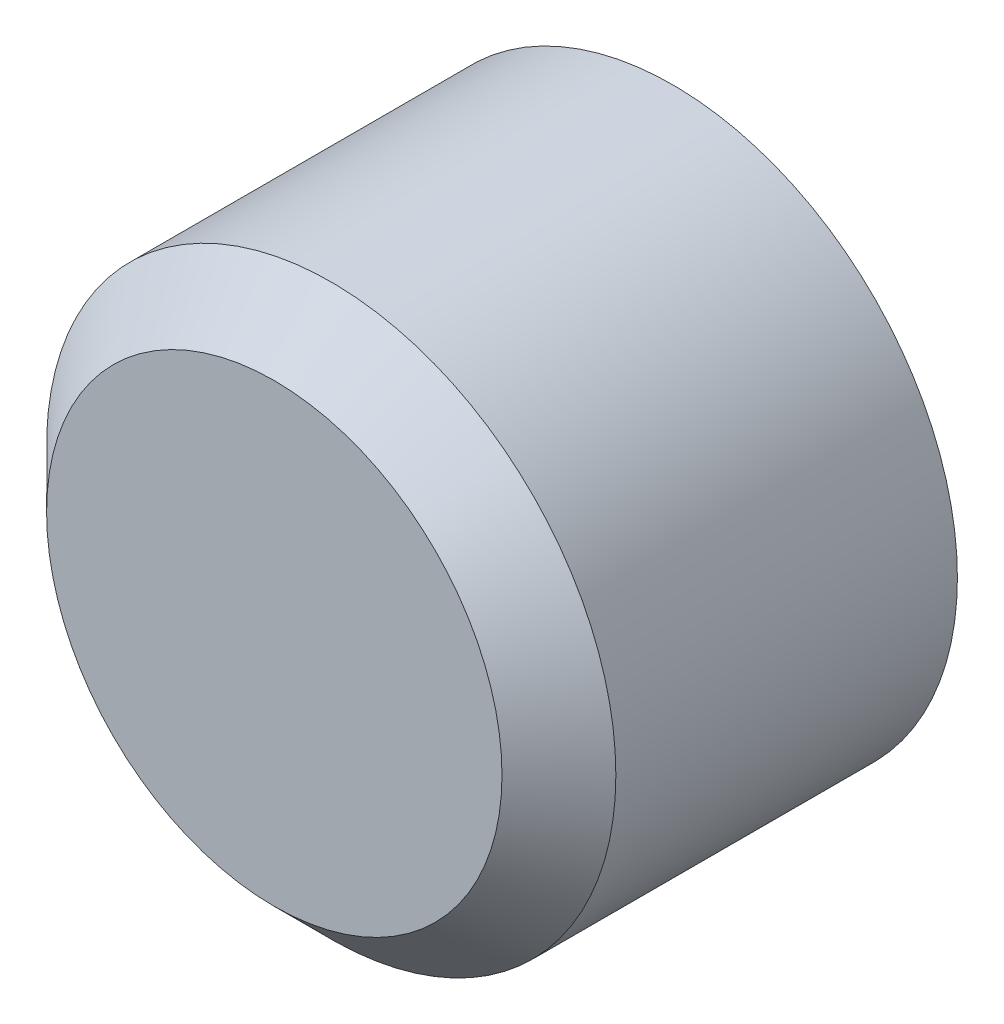
ISO-10303-21;
HEADER;
FILE_DESCRIPTION(('STEP AP214'),'2;1');
FILE_NAME('part.step','',(''),(''),'','','');
FILE_SCHEMA(('AUTOMOTIVE_DESIGN { 1 0 10303 214 1 1 1 1 }'));
ENDSEC;
DATA;
#1=APPLICATION_CONTEXT('core data for automotive mechanical design processes');
#2=APPLICATION_PROTOCOL_DEFINITION('international standard','automotive_design',2000,#1);
#3=PRODUCT_CONTEXT('',#1,'mechanical');
#4=PRODUCT('Part','Part','',(#3));
#5=PRODUCT_RELATED_PRODUCT_CATEGORY('part','',(#4));
#6=PRODUCT_DEFINITION_FORMATION('','',#4);
#7=PRODUCT_DEFINITION_CONTEXT('part definition',#1,'design');
#8=PRODUCT_DEFINITION('design','',#6,#7);
#9=PRODUCT_DEFINITION_SHAPE('','',#8);
#10=(LENGTH_UNIT() NAMED_UNIT(*) SI_UNIT(.MILLI.,.METRE.));
#11=(NAMED_UNIT(*) PLANE_ANGLE_UNIT() SI_UNIT($,.RADIAN.));
#12=(NAMED_UNIT(*) SI_UNIT($,.STERADIAN.) SOLID_ANGLE_UNIT());
#13=UNCERTAINTY_MEASURE_WITH_UNIT(LENGTH_MEASURE(1.E-05),#10,'distance_accuracy_value','');
#14=(GEOMETRIC_REPRESENTATION_CONTEXT(3) GLOBAL_UNCERTAINTY_ASSIGNED_CONTEXT((#13)) GLOBAL_UNIT_ASSIGNED_CONTEXT((#10,
#11,#12)) REPRESENTATION_CONTEXT('',''));
#15=CARTESIAN_POINT('',(0.,0.,0.));
#16=DIRECTION('',(0.,0.,1.));
#17=DIRECTION('',(1.,0.,0.));
#18=AXIS2_PLACEMENT_3D('',#15,#16,#17);
#19=CARTESIAN_POINT('',(0.,0.,7.));
#20=DIRECTION('',(0.,0.,-1.));
#21=DIRECTION('',(-1.,0.,0.));
#22=AXIS2_PLACEMENT_3D('',#19,#20,#21);
#23=CYLINDRICAL_SURFACE('',#22,5.);
#24=CARTESIAN_POINT('',(0.,0.,6.));
#25=DIRECTION('',(0.,0.,1.));
#26=DIRECTION('',(1.,0.,0.));
#27=AXIS2_PLACEMENT_3D('',#24,#25,#26);
#28=CIRCLE('',#27,5.);
#29=CARTESIAN_POINT('',(5.,0.,6.));
#30=VERTEX_POINT('',#29);
#31=EDGE_CURVE('E10',#30,#30,#28,.F.);
#32=ORIENTED_EDGE('',*,*,#31,.T.);
#33=EDGE_LOOP('',(#32));
#34=FACE_BOUND('',#33,.T.);
#35=CARTESIAN_POINT('',(0.,0.,0.));
#36=DIRECTION('',(0.,0.,1.));
#37=DIRECTION('',(1.,0.,0.));
#38=AXIS2_PLACEMENT_3D('',#35,#36,#37);
#39=CIRCLE('',#38,5.);
#40=CARTESIAN_POINT('',(5.,0.,0.));
#41=VERTEX_POINT('',#40);
#42=EDGE_CURVE('E42',#41,#41,#39,.T.);
#43=ORIENTED_EDGE('',*,*,#42,.T.);
#44=EDGE_LOOP('',(#43));
#45=FACE_BOUND('',#44,.T.);
#46=ADVANCED_FACE('F31',(#34,#45),#23,.T.);
#47=CARTESIAN_POINT('',(0.,0.,7.));
#48=DIRECTION('',(0.,0.,1.));
#49=DIRECTION('',(1.,0.,0.));
#50=AXIS2_PLACEMENT_3D('',#47,#48,#49);
#51=PLANE('',#50);
#52=CARTESIAN_POINT('',(0.,0.,7.));
#53=DIRECTION('',(0.,0.,1.));
#54=DIRECTION('',(1.,0.,0.));
#55=AXIS2_PLACEMENT_3D('',#52,#53,#54);
#56=CIRCLE('',#55,4.);
#57=CARTESIAN_POINT('',(4.,0.,7.));
#58=VERTEX_POINT('',#57);
#59=EDGE_CURVE('E38',#58,#58,#56,.T.);
#60=ORIENTED_EDGE('',*,*,#59,.T.);
#61=EDGE_LOOP('',(#60));
#62=FACE_BOUND('',#61,.T.);
#63=ADVANCED_FACE('F52',(#62),#51,.T.);
#64=CARTESIAN_POINT('',(0.,0.,0.));
#65=DIRECTION('',(0.,0.,1.));
#66=DIRECTION('',(1.,0.,0.));
#67=AXIS2_PLACEMENT_3D('',#64,#65,#66);
#68=PLANE('',#67);
#69=ORIENTED_EDGE('',*,*,#42,.F.);
#70=EDGE_LOOP('',(#69));
#71=FACE_BOUND('',#70,.T.);
#72=ADVANCED_FACE('F50',(#71),#68,.F.);
#73=CARTESIAN_POINT('',(0.,0.,7.));
#74=DIRECTION('',(0.,0.,-1.));
#75=DIRECTION('',(-1.,0.,0.));
#76=AXIS2_PLACEMENT_3D('',#73,#74,#75);
#77=CONICAL_SURFACE('',#76,4.,0.785398163397447);
#78=ORIENTED_EDGE('',*,*,#31,.F.);
#79=EDGE_LOOP('',(#78));
#80=FACE_BOUND('',#79,.T.);
#81=ORIENTED_EDGE('',*,*,#59,.F.);
#82=EDGE_LOOP('',(#81));
#83=FACE_BOUND('',#82,.T.);
#84=ADVANCED_FACE('F33',(#80,#83),#77,.T.);
#85=CLOSED_SHELL('',(#46,#63,#72,#84));
#86=MANIFOLD_SOLID_BREP('B2',#85);
#87=ADVANCED_BREP_SHAPE_REPRESENTATION('',(#18,#86),#14);
#88=SHAPE_DEFINITION_REPRESENTATION(#9,#87);
ENDSEC;
END-ISO-10303-21;
